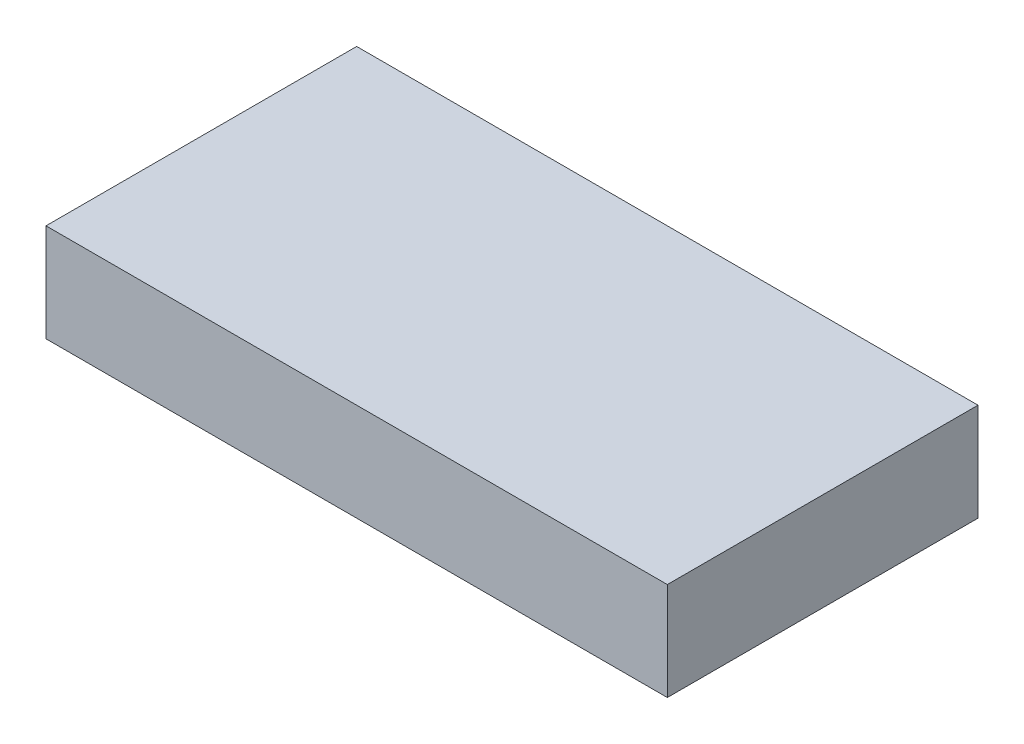
ISO-10303-21;
HEADER;
FILE_DESCRIPTION(('STEP AP214'),'2;1');
FILE_NAME('part.step','',(''),(''),'','','');
FILE_SCHEMA(('AUTOMOTIVE_DESIGN { 1 0 10303 214 1 1 1 1 }'));
ENDSEC;
DATA;
#1=APPLICATION_CONTEXT('core data for automotive mechanical design processes');
#2=APPLICATION_PROTOCOL_DEFINITION('international standard','automotive_design',2000,#1);
#3=PRODUCT_CONTEXT('',#1,'mechanical');
#4=PRODUCT('Part','Part','',(#3));
#5=PRODUCT_RELATED_PRODUCT_CATEGORY('part','',(#4));
#6=PRODUCT_DEFINITION_FORMATION('','',#4);
#7=PRODUCT_DEFINITION_CONTEXT('part definition',#1,'design');
#8=PRODUCT_DEFINITION('design','',#6,#7);
#9=PRODUCT_DEFINITION_SHAPE('','',#8);
#10=(LENGTH_UNIT() NAMED_UNIT(*) SI_UNIT(.MILLI.,.METRE.));
#11=(NAMED_UNIT(*) PLANE_ANGLE_UNIT() SI_UNIT($,.RADIAN.));
#12=(NAMED_UNIT(*) SI_UNIT($,.STERADIAN.) SOLID_ANGLE_UNIT());
#13=UNCERTAINTY_MEASURE_WITH_UNIT(LENGTH_MEASURE(1.E-05),#10,'distance_accuracy_value','');
#14=(GEOMETRIC_REPRESENTATION_CONTEXT(3) GLOBAL_UNCERTAINTY_ASSIGNED_CONTEXT((#13)) GLOBAL_UNIT_ASSIGNED_CONTEXT((#10,
#11,#12)) REPRESENTATION_CONTEXT('',''));
#15=CARTESIAN_POINT('',(0.,0.,0.));
#16=DIRECTION('',(0.,0.,1.));
#17=DIRECTION('',(1.,0.,0.));
#18=AXIS2_PLACEMENT_3D('',#15,#16,#17);
#19=CARTESIAN_POINT('',(0.,-6.3,0.));
#20=DIRECTION('',(-1.,0.,0.));
#21=DIRECTION('',(0.,0.,1.));
#22=AXIS2_PLACEMENT_3D('',#19,#20,#21);
#23=PLANE('',#22);
#24=DIRECTION('',(0.,0.,1.));
#25=VECTOR('',#24,1.);
#26=CARTESIAN_POINT('',(0.,0.,0.));
#27=LINE('',#26,#25);
#28=CARTESIAN_POINT('',(0.,0.,-20.));
#29=VERTEX_POINT('',#28);
#30=CARTESIAN_POINT('',(0.,0.,0.));
#31=VERTEX_POINT('',#30);
#32=EDGE_CURVE('E107',#29,#31,#27,.T.);
#33=ORIENTED_EDGE('',*,*,#32,.F.);
#34=DIRECTION('',(0.,1.,0.));
#35=VECTOR('',#34,1.);
#36=CARTESIAN_POINT('',(0.,-6.3,-20.));
#37=LINE('',#36,#35);
#38=CARTESIAN_POINT('',(0.,-6.3,-20.));
#39=VERTEX_POINT('',#38);
#40=EDGE_CURVE('E11',#39,#29,#37,.T.);
#41=ORIENTED_EDGE('',*,*,#40,.F.);
#42=DIRECTION('',(0.,0.,1.));
#43=VECTOR('',#42,1.);
#44=CARTESIAN_POINT('',(0.,-6.3,0.));
#45=LINE('',#44,#43);
#46=CARTESIAN_POINT('',(0.,-6.3,0.));
#47=VERTEX_POINT('',#46);
#48=EDGE_CURVE('E102',#39,#47,#45,.T.);
#49=ORIENTED_EDGE('',*,*,#48,.T.);
#50=DIRECTION('',(0.,1.,0.));
#51=VECTOR('',#50,1.);
#52=CARTESIAN_POINT('',(0.,-6.3,0.));
#53=LINE('',#52,#51);
#54=EDGE_CURVE('E46',#47,#31,#53,.T.);
#55=ORIENTED_EDGE('',*,*,#54,.T.);
#56=EDGE_LOOP('',(#33,#41,#49,#55));
#57=FACE_BOUND('',#56,.T.);
#58=ADVANCED_FACE('F43',(#57),#23,.T.);
#59=CARTESIAN_POINT('',(0.,-6.3,-20.));
#60=DIRECTION('',(0.,0.,-1.));
#61=DIRECTION('',(-1.,0.,0.));
#62=AXIS2_PLACEMENT_3D('',#59,#60,#61);
#63=PLANE('',#62);
#64=DIRECTION('',(-1.,0.,0.));
#65=VECTOR('',#64,1.);
#66=CARTESIAN_POINT('',(0.,0.,-20.));
#67=LINE('',#66,#65);
#68=CARTESIAN_POINT('',(40.,0.,-20.));
#69=VERTEX_POINT('',#68);
#70=EDGE_CURVE('E104',#69,#29,#67,.T.);
#71=ORIENTED_EDGE('',*,*,#70,.F.);
#72=DIRECTION('',(0.,1.,0.));
#73=VECTOR('',#72,1.);
#74=CARTESIAN_POINT('',(40.,-6.3,-20.));
#75=LINE('',#74,#73);
#76=CARTESIAN_POINT('',(40.,-6.3,-20.));
#77=VERTEX_POINT('',#76);
#78=EDGE_CURVE('E55',#77,#69,#75,.T.);
#79=ORIENTED_EDGE('',*,*,#78,.F.);
#80=DIRECTION('',(-1.,0.,0.));
#81=VECTOR('',#80,1.);
#82=CARTESIAN_POINT('',(0.,-6.3,-20.));
#83=LINE('',#82,#81);
#84=EDGE_CURVE('E97',#77,#39,#83,.T.);
#85=ORIENTED_EDGE('',*,*,#84,.T.);
#86=ORIENTED_EDGE('',*,*,#40,.T.);
#87=EDGE_LOOP('',(#71,#79,#85,#86));
#88=FACE_BOUND('',#87,.T.);
#89=ADVANCED_FACE('F117',(#88),#63,.T.);
#90=CARTESIAN_POINT('',(40.,-6.3,0.));
#91=DIRECTION('',(1.,0.,0.));
#92=DIRECTION('',(0.,0.,-1.));
#93=AXIS2_PLACEMENT_3D('',#90,#91,#92);
#94=PLANE('',#93);
#95=DIRECTION('',(0.,0.,-1.));
#96=VECTOR('',#95,1.);
#97=CARTESIAN_POINT('',(40.,0.,0.));
#98=LINE('',#97,#96);
#99=CARTESIAN_POINT('',(40.,0.,0.));
#100=VERTEX_POINT('',#99);
#101=EDGE_CURVE('E93',#100,#69,#98,.T.);
#102=ORIENTED_EDGE('',*,*,#101,.F.);
#103=DIRECTION('',(0.,1.,0.));
#104=VECTOR('',#103,1.);
#105=CARTESIAN_POINT('',(40.,-6.3,0.));
#106=LINE('',#105,#104);
#107=CARTESIAN_POINT('',(40.,-6.3,0.));
#108=VERTEX_POINT('',#107);
#109=EDGE_CURVE('E88',#108,#100,#106,.T.);
#110=ORIENTED_EDGE('',*,*,#109,.F.);
#111=DIRECTION('',(0.,0.,-1.));
#112=VECTOR('',#111,1.);
#113=CARTESIAN_POINT('',(40.,-6.3,0.));
#114=LINE('',#113,#112);
#115=EDGE_CURVE('E91',#108,#77,#114,.T.);
#116=ORIENTED_EDGE('',*,*,#115,.T.);
#117=ORIENTED_EDGE('',*,*,#78,.T.);
#118=EDGE_LOOP('',(#102,#110,#116,#117));
#119=FACE_BOUND('',#118,.T.);
#120=ADVANCED_FACE('F89',(#119),#94,.T.);
#121=CARTESIAN_POINT('',(0.,-6.3,0.));
#122=DIRECTION('',(0.,0.,1.));
#123=DIRECTION('',(1.,0.,0.));
#124=AXIS2_PLACEMENT_3D('',#121,#122,#123);
#125=PLANE('',#124);
#126=DIRECTION('',(1.,0.,0.));
#127=VECTOR('',#126,1.);
#128=CARTESIAN_POINT('',(0.,0.,0.));
#129=LINE('',#128,#127);
#130=EDGE_CURVE('E110',#31,#100,#129,.T.);
#131=ORIENTED_EDGE('',*,*,#130,.F.);
#132=ORIENTED_EDGE('',*,*,#54,.F.);
#133=DIRECTION('',(1.,0.,0.));
#134=VECTOR('',#133,1.);
#135=CARTESIAN_POINT('',(0.,-6.3,0.));
#136=LINE('',#135,#134);
#137=EDGE_CURVE('E100',#47,#108,#136,.T.);
#138=ORIENTED_EDGE('',*,*,#137,.T.);
#139=ORIENTED_EDGE('',*,*,#109,.T.);
#140=EDGE_LOOP('',(#131,#132,#138,#139));
#141=FACE_BOUND('',#140,.T.);
#142=ADVANCED_FACE('F99',(#141),#125,.T.);
#143=CARTESIAN_POINT('',(0.,-6.3,0.));
#144=DIRECTION('',(0.,-1.,0.));
#145=DIRECTION('',(0.,0.,-1.));
#146=AXIS2_PLACEMENT_3D('',#143,#144,#145);
#147=PLANE('',#146);
#148=ORIENTED_EDGE('',*,*,#48,.F.);
#149=ORIENTED_EDGE('',*,*,#84,.F.);
#150=ORIENTED_EDGE('',*,*,#115,.F.);
#151=ORIENTED_EDGE('',*,*,#137,.F.);
#152=EDGE_LOOP('',(#148,#149,#150,#151));
#153=FACE_BOUND('',#152,.T.);
#154=ADVANCED_FACE('F96',(#153),#147,.T.);
#155=CARTESIAN_POINT('',(0.,0.,0.));
#156=DIRECTION('',(0.,-1.,0.));
#157=DIRECTION('',(0.,0.,-1.));
#158=AXIS2_PLACEMENT_3D('',#155,#156,#157);
#159=PLANE('',#158);
#160=ORIENTED_EDGE('',*,*,#32,.T.);
#161=ORIENTED_EDGE('',*,*,#130,.T.);
#162=ORIENTED_EDGE('',*,*,#101,.T.);
#163=ORIENTED_EDGE('',*,*,#70,.T.);
#164=EDGE_LOOP('',(#160,#161,#162,#163));
#165=FACE_BOUND('',#164,.T.);
#166=ADVANCED_FACE('F116',(#165),#159,.F.);
#167=CLOSED_SHELL('',(#58,#89,#120,#142,#154,#166));
#168=MANIFOLD_SOLID_BREP('B2',#167);
#169=ADVANCED_BREP_SHAPE_REPRESENTATION('',(#18,#168),#14);
#170=SHAPE_DEFINITION_REPRESENTATION(#9,#169);
ENDSEC;
END-ISO-10303-21;
